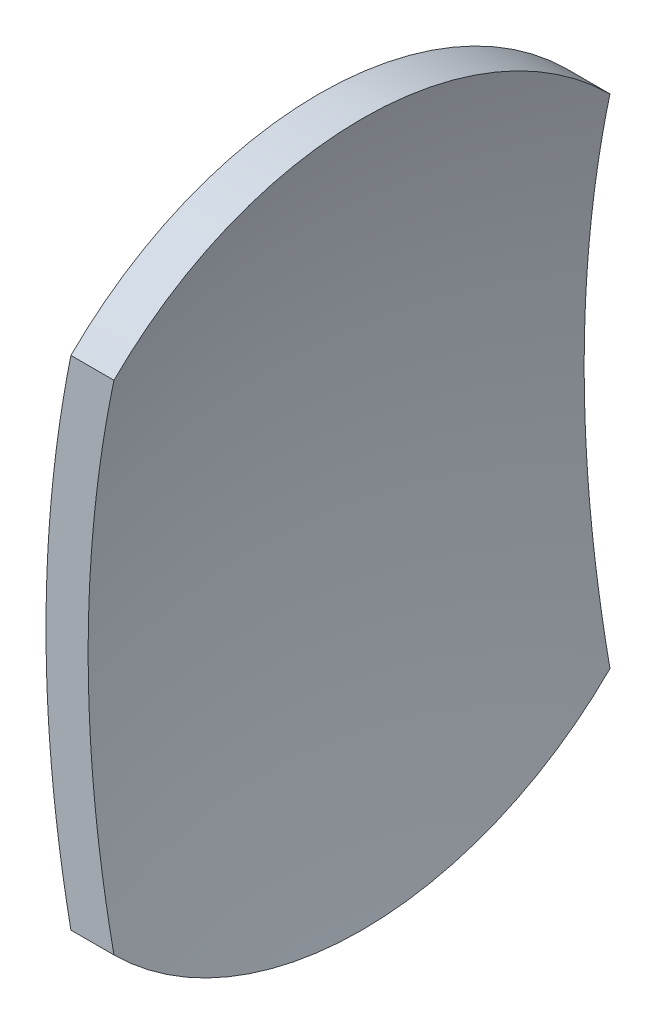
ISO-10303-21;
HEADER;
FILE_DESCRIPTION(('STEP AP214'),'2;1');
FILE_NAME('part.step','',(''),(''),'','','');
FILE_SCHEMA(('AUTOMOTIVE_DESIGN { 1 0 10303 214 1 1 1 1 }'));
ENDSEC;
DATA;
#1=APPLICATION_CONTEXT('core data for automotive mechanical design processes');
#2=APPLICATION_PROTOCOL_DEFINITION('international standard','automotive_design',2000,#1);
#3=PRODUCT_CONTEXT('',#1,'mechanical');
#4=PRODUCT('Part','Part','',(#3));
#5=PRODUCT_RELATED_PRODUCT_CATEGORY('part','',(#4));
#6=PRODUCT_DEFINITION_FORMATION('','',#4);
#7=PRODUCT_DEFINITION_CONTEXT('part definition',#1,'design');
#8=PRODUCT_DEFINITION('design','',#6,#7);
#9=PRODUCT_DEFINITION_SHAPE('','',#8);
#10=(LENGTH_UNIT() NAMED_UNIT(*) SI_UNIT(.MILLI.,.METRE.));
#11=(NAMED_UNIT(*) PLANE_ANGLE_UNIT() SI_UNIT($,.RADIAN.));
#12=(NAMED_UNIT(*) SI_UNIT($,.STERADIAN.) SOLID_ANGLE_UNIT());
#13=UNCERTAINTY_MEASURE_WITH_UNIT(LENGTH_MEASURE(1.E-05),#10,'distance_accuracy_value','');
#14=(GEOMETRIC_REPRESENTATION_CONTEXT(3) GLOBAL_UNCERTAINTY_ASSIGNED_CONTEXT((#13)) GLOBAL_UNIT_ASSIGNED_CONTEXT((#10,
#11,#12)) REPRESENTATION_CONTEXT('',''));
#15=CARTESIAN_POINT('',(0.,0.,0.));
#16=DIRECTION('',(0.,0.,1.));
#17=DIRECTION('',(1.,0.,0.));
#18=AXIS2_PLACEMENT_3D('',#15,#16,#17);
#19=CARTESIAN_POINT('',(0.,0.,0.));
#20=DIRECTION('',(1.,0.,0.));
#21=DIRECTION('',(0.,0.,-1.));
#22=AXIS2_PLACEMENT_3D('',#19,#20,#21);
#23=CYLINDRICAL_SURFACE('',#22,17.);
#24=DIRECTION('',(1.,0.,0.));
#25=VECTOR('',#24,1.);
#26=CARTESIAN_POINT('',(-62.001,12.0415945787923,12.));
#27=LINE('',#26,#25);
#28=CARTESIAN_POINT('',(-59.6238207430554,12.0415945787923,12.));
#29=VERTEX_POINT('',#28);
#30=CARTESIAN_POINT('',(-57.5412895232632,12.0415945787923,12.));
#31=VERTEX_POINT('',#30);
#32=EDGE_CURVE('E64',#29,#31,#27,.T.);
#33=ORIENTED_EDGE('',*,*,#32,.T.);
#34=CARTESIAN_POINT('',(-57.5412895232632,0.,0.));
#35=DIRECTION('',(1.,0.,0.));
#36=DIRECTION('',(0.,0.,-1.));
#37=AXIS2_PLACEMENT_3D('',#34,#35,#36);
#38=CIRCLE('',#37,17.);
#39=CARTESIAN_POINT('',(-57.5412895232632,12.0415945787923,-12.));
#40=VERTEX_POINT('',#39);
#41=EDGE_CURVE('E12',#40,#31,#38,.T.);
#42=ORIENTED_EDGE('',*,*,#41,.F.);
#43=DIRECTION('',(1.,0.,0.));
#44=VECTOR('',#43,1.);
#45=CARTESIAN_POINT('',(-62.001,12.0415945787923,-12.));
#46=LINE('',#45,#44);
#47=CARTESIAN_POINT('',(-59.6238207430554,12.0415945787923,-12.));
#48=VERTEX_POINT('',#47);
#49=EDGE_CURVE('E96',#48,#40,#46,.T.);
#50=ORIENTED_EDGE('',*,*,#49,.F.);
#51=CARTESIAN_POINT('',(-59.6238207430554,0.,0.));
#52=DIRECTION('',(1.,0.,0.));
#53=DIRECTION('',(0.,0.,-1.));
#54=AXIS2_PLACEMENT_3D('',#51,#52,#53);
#55=CIRCLE('',#54,17.);
#56=EDGE_CURVE('E100',#48,#29,#55,.T.);
#57=ORIENTED_EDGE('',*,*,#56,.T.);
#58=EDGE_LOOP('',(#33,#42,#50,#57));
#59=FACE_BOUND('',#58,.T.);
#60=ADVANCED_FACE('F41',(#59),#23,.T.);
#61=CARTESIAN_POINT('',(0.,0.,0.));
#62=DIRECTION('',(1.,0.,0.));
#63=DIRECTION('',(0.,1.,0.));
#64=AXIS2_PLACEMENT_3D('',#61,#62,#63);
#65=SPHERICAL_SURFACE('',#64,60.);
#66=CARTESIAN_POINT('',(0.,0.,12.));
#67=DIRECTION('',(0.,0.,-1.));
#68=DIRECTION('',(-1.,0.,0.));
#69=AXIS2_PLACEMENT_3D('',#66,#67,#68);
#70=CIRCLE('',#69,58.7877538267963);
#71=CARTESIAN_POINT('',(-57.5412895232632,-12.0415945787923,12.));
#72=VERTEX_POINT('',#71);
#73=EDGE_CURVE('E88',#31,#72,#70,.F.);
#74=ORIENTED_EDGE('',*,*,#73,.T.);
#75=CARTESIAN_POINT('',(-57.5412895232632,-12.0415945787923,-12.));
#76=VERTEX_POINT('',#75);
#77=EDGE_CURVE('E49',#72,#76,#38,.T.);
#78=ORIENTED_EDGE('',*,*,#77,.T.);
#79=CARTESIAN_POINT('',(0.,0.,-12.));
#80=DIRECTION('',(0.,0.,1.));
#81=DIRECTION('',(1.,0.,0.));
#82=AXIS2_PLACEMENT_3D('',#79,#80,#81);
#83=CIRCLE('',#82,58.7877538267963);
#84=EDGE_CURVE('E106',#76,#40,#83,.F.);
#85=ORIENTED_EDGE('',*,*,#84,.T.);
#86=ORIENTED_EDGE('',*,*,#41,.T.);
#87=EDGE_LOOP('',(#74,#78,#85,#86));
#88=FACE_BOUND('',#87,.T.);
#89=ADVANCED_FACE('F43',(#88),#65,.F.);
#90=DIRECTION('',(1.,0.,0.));
#91=VECTOR('',#90,1.);
#92=CARTESIAN_POINT('',(-62.001,-12.0415945787923,12.));
#93=LINE('',#92,#91);
#94=CARTESIAN_POINT('',(-59.6238207430554,-12.0415945787923,12.));
#95=VERTEX_POINT('',#94);
#96=EDGE_CURVE('E82',#95,#72,#93,.T.);
#97=ORIENTED_EDGE('',*,*,#96,.F.);
#98=CARTESIAN_POINT('',(-59.6238207430554,-12.0415945787923,-12.));
#99=VERTEX_POINT('',#98);
#100=EDGE_CURVE('E94',#95,#99,#55,.T.);
#101=ORIENTED_EDGE('',*,*,#100,.T.);
#102=DIRECTION('',(1.,0.,0.));
#103=VECTOR('',#102,1.);
#104=CARTESIAN_POINT('',(-62.001,-12.0415945787923,-12.));
#105=LINE('',#104,#103);
#106=EDGE_CURVE('E56',#99,#76,#105,.T.);
#107=ORIENTED_EDGE('',*,*,#106,.T.);
#108=ORIENTED_EDGE('',*,*,#77,.F.);
#109=EDGE_LOOP('',(#97,#101,#107,#108));
#110=FACE_BOUND('',#109,.T.);
#111=ADVANCED_FACE('F93',(#110),#23,.T.);
#112=CARTESIAN_POINT('',(0.,0.,0.));
#113=DIRECTION('',(1.,0.,0.));
#114=DIRECTION('',(0.,1.,0.));
#115=AXIS2_PLACEMENT_3D('',#112,#113,#114);
#116=SPHERICAL_SURFACE('',#115,62.);
#117=CARTESIAN_POINT('',(0.,0.,12.));
#118=DIRECTION('',(0.,0.,-1.));
#119=DIRECTION('',(-1.,0.,0.));
#120=AXIS2_PLACEMENT_3D('',#117,#118,#119);
#121=CIRCLE('',#120,60.8276253029822);
#122=EDGE_CURVE('E79',#95,#29,#121,.T.);
#123=ORIENTED_EDGE('',*,*,#122,.T.);
#124=ORIENTED_EDGE('',*,*,#56,.F.);
#125=CARTESIAN_POINT('',(0.,0.,-12.));
#126=DIRECTION('',(0.,0.,1.));
#127=DIRECTION('',(1.,0.,0.));
#128=AXIS2_PLACEMENT_3D('',#125,#126,#127);
#129=CIRCLE('',#128,60.8276253029822);
#130=EDGE_CURVE('E99',#48,#99,#129,.T.);
#131=ORIENTED_EDGE('',*,*,#130,.T.);
#132=ORIENTED_EDGE('',*,*,#100,.F.);
#133=EDGE_LOOP('',(#123,#124,#131,#132));
#134=FACE_BOUND('',#133,.T.);
#135=ADVANCED_FACE('F98',(#134),#116,.T.);
#136=CARTESIAN_POINT('',(-62.001,12.0415945787923,-12.));
#137=DIRECTION('',(0.,0.,1.));
#138=DIRECTION('',(1.,0.,0.));
#139=AXIS2_PLACEMENT_3D('',#136,#137,#138);
#140=PLANE('',#139);
#141=ORIENTED_EDGE('',*,*,#106,.F.);
#142=ORIENTED_EDGE('',*,*,#130,.F.);
#143=ORIENTED_EDGE('',*,*,#49,.T.);
#144=ORIENTED_EDGE('',*,*,#84,.F.);
#145=EDGE_LOOP('',(#141,#142,#143,#144));
#146=FACE_BOUND('',#145,.T.);
#147=ADVANCED_FACE('F113',(#146),#140,.F.);
#148=CARTESIAN_POINT('',(-62.001,12.0415945787923,12.));
#149=DIRECTION('',(0.,0.,-1.));
#150=DIRECTION('',(-1.,0.,0.));
#151=AXIS2_PLACEMENT_3D('',#148,#149,#150);
#152=PLANE('',#151);
#153=ORIENTED_EDGE('',*,*,#32,.F.);
#154=ORIENTED_EDGE('',*,*,#122,.F.);
#155=ORIENTED_EDGE('',*,*,#96,.T.);
#156=ORIENTED_EDGE('',*,*,#73,.F.);
#157=EDGE_LOOP('',(#153,#154,#155,#156));
#158=FACE_BOUND('',#157,.T.);
#159=ADVANCED_FACE('F81',(#158),#152,.F.);
#160=CLOSED_SHELL('',(#60,#89,#111,#135,#147,#159));
#161=MANIFOLD_SOLID_BREP('B2',#160);
#162=ADVANCED_BREP_SHAPE_REPRESENTATION('',(#18,#161),#14);
#163=SHAPE_DEFINITION_REPRESENTATION(#9,#162);
ENDSEC;
END-ISO-10303-21;
